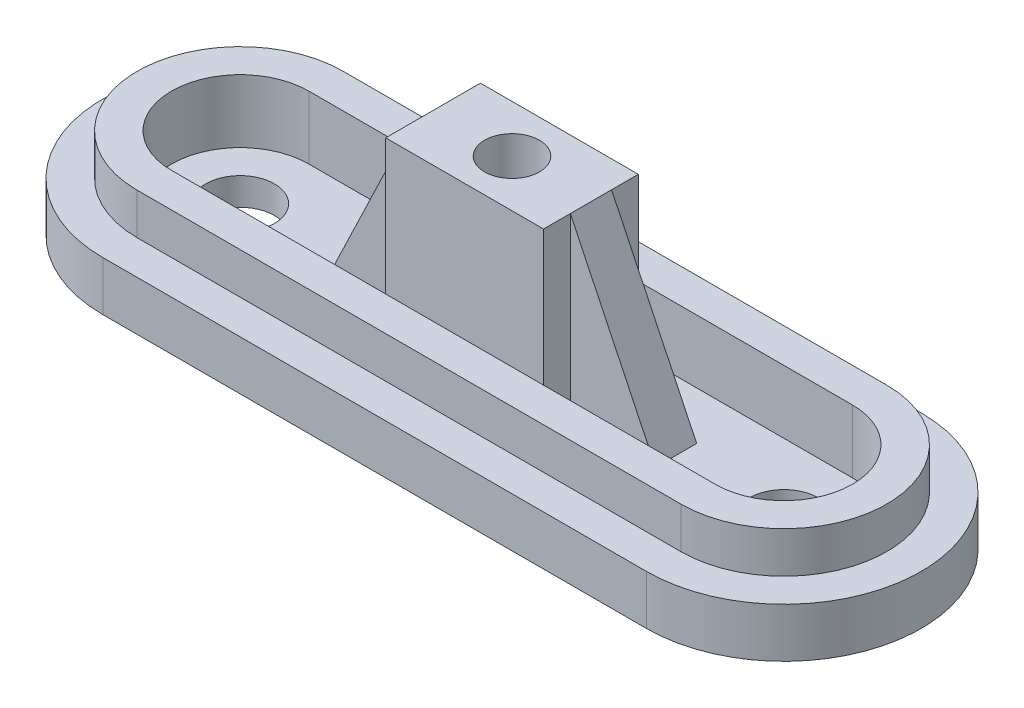
ISO-10303-21;
HEADER;
FILE_DESCRIPTION(('STEP AP214'),'2;1');
FILE_NAME('part.step','',(''),(''),'','','');
FILE_SCHEMA(('AUTOMOTIVE_DESIGN { 1 0 10303 214 1 1 1 1 }'));
ENDSEC;
DATA;
#1=APPLICATION_CONTEXT('core data for automotive mechanical design processes');
#2=APPLICATION_PROTOCOL_DEFINITION('international standard','automotive_design',2000,#1);
#3=PRODUCT_CONTEXT('',#1,'mechanical');
#4=PRODUCT('Part','Part','',(#3));
#5=PRODUCT_RELATED_PRODUCT_CATEGORY('part','',(#4));
#6=PRODUCT_DEFINITION_FORMATION('','',#4);
#7=PRODUCT_DEFINITION_CONTEXT('part definition',#1,'design');
#8=PRODUCT_DEFINITION('design','',#6,#7);
#9=PRODUCT_DEFINITION_SHAPE('','',#8);
#10=(LENGTH_UNIT() NAMED_UNIT(*) SI_UNIT(.MILLI.,.METRE.));
#11=(NAMED_UNIT(*) PLANE_ANGLE_UNIT() SI_UNIT($,.RADIAN.));
#12=(NAMED_UNIT(*) SI_UNIT($,.STERADIAN.) SOLID_ANGLE_UNIT());
#13=UNCERTAINTY_MEASURE_WITH_UNIT(LENGTH_MEASURE(1.E-05),#10,'distance_accuracy_value','');
#14=(GEOMETRIC_REPRESENTATION_CONTEXT(3) GLOBAL_UNCERTAINTY_ASSIGNED_CONTEXT((#13)) GLOBAL_UNIT_ASSIGNED_CONTEXT((#10,
#11,#12)) REPRESENTATION_CONTEXT('',''));
#15=CARTESIAN_POINT('',(0.,0.,0.));
#16=DIRECTION('',(0.,0.,1.));
#17=DIRECTION('',(1.,0.,0.));
#18=AXIS2_PLACEMENT_3D('',#15,#16,#17);
#19=CARTESIAN_POINT('',(57.5,149.,0.));
#20=DIRECTION('',(-1.,0.,0.));
#21=DIRECTION('',(0.,0.,1.));
#22=AXIS2_PLACEMENT_3D('',#19,#20,#21);
#23=PLANE('',#22);
#24=DIRECTION('',(0.,-1.,0.));
#25=VECTOR('',#24,1.);
#26=CARTESIAN_POINT('',(57.5,149.,15.));
#27=LINE('',#26,#25);
#28=CARTESIAN_POINT('',(57.5,149.,15.));
#29=VERTEX_POINT('',#28);
#30=CARTESIAN_POINT('',(57.5,20.,15.));
#31=VERTEX_POINT('',#30);
#32=EDGE_CURVE('E197',#29,#31,#27,.T.);
#33=ORIENTED_EDGE('',*,*,#32,.F.);
#34=DIRECTION('',(0.,0.,-1.));
#35=VECTOR('',#34,1.);
#36=CARTESIAN_POINT('',(57.5,149.,0.));
#37=LINE('',#36,#35);
#38=CARTESIAN_POINT('',(57.5,149.,34.5));
#39=VERTEX_POINT('',#38);
#40=EDGE_CURVE('E254',#39,#29,#37,.T.);
#41=ORIENTED_EDGE('',*,*,#40,.F.);
#42=DIRECTION('',(0.,-1.,0.));
#43=VECTOR('',#42,1.);
#44=CARTESIAN_POINT('',(57.5,149.,34.5));
#45=LINE('',#44,#43);
#46=CARTESIAN_POINT('',(57.5,20.,34.5));
#47=VERTEX_POINT('',#46);
#48=EDGE_CURVE('E283',#39,#47,#45,.T.);
#49=ORIENTED_EDGE('',*,*,#48,.T.);
#50=DIRECTION('',(0.,0.,-1.));
#51=VECTOR('',#50,1.);
#52=CARTESIAN_POINT('',(57.5,20.,0.));
#53=LINE('',#52,#51);
#54=EDGE_CURVE('E317',#47,#31,#53,.T.);
#55=ORIENTED_EDGE('',*,*,#54,.T.);
#56=EDGE_LOOP('',(#33,#41,#49,#55));
#57=FACE_BOUND('',#56,.T.);
#58=ADVANCED_FACE('F43',(#57),#23,.F.);
#59=CARTESIAN_POINT('',(-57.5,149.,0.));
#60=DIRECTION('',(-1.,0.,0.));
#61=DIRECTION('',(0.,0.,1.));
#62=AXIS2_PLACEMENT_3D('',#59,#60,#61);
#63=PLANE('',#62);
#64=DIRECTION('',(0.,0.,-1.));
#65=VECTOR('',#64,1.);
#66=CARTESIAN_POINT('',(-57.5,149.,0.));
#67=LINE('',#66,#65);
#68=CARTESIAN_POINT('',(-57.5,149.,34.5));
#69=VERTEX_POINT('',#68);
#70=CARTESIAN_POINT('',(-57.5,149.,15.));
#71=VERTEX_POINT('',#70);
#72=EDGE_CURVE('E263',#69,#71,#67,.T.);
#73=ORIENTED_EDGE('',*,*,#72,.T.);
#74=DIRECTION('',(0.,-1.,0.));
#75=VECTOR('',#74,1.);
#76=CARTESIAN_POINT('',(-57.5,149.,15.));
#77=LINE('',#76,#75);
#78=CARTESIAN_POINT('',(-57.5,20.,15.));
#79=VERTEX_POINT('',#78);
#80=EDGE_CURVE('E228',#71,#79,#77,.T.);
#81=ORIENTED_EDGE('',*,*,#80,.T.);
#82=DIRECTION('',(0.,0.,-1.));
#83=VECTOR('',#82,1.);
#84=CARTESIAN_POINT('',(-57.5,20.,0.));
#85=LINE('',#84,#83);
#86=CARTESIAN_POINT('',(-57.5,20.,34.5));
#87=VERTEX_POINT('',#86);
#88=EDGE_CURVE('E322',#87,#79,#85,.T.);
#89=ORIENTED_EDGE('',*,*,#88,.F.);
#90=DIRECTION('',(0.,-1.,0.));
#91=VECTOR('',#90,1.);
#92=CARTESIAN_POINT('',(-57.5,149.,34.5));
#93=LINE('',#92,#91);
#94=EDGE_CURVE('E267',#69,#87,#93,.T.);
#95=ORIENTED_EDGE('',*,*,#94,.F.);
#96=EDGE_LOOP('',(#73,#81,#89,#95));
#97=FACE_BOUND('',#96,.T.);
#98=ADVANCED_FACE('F523',(#97),#63,.T.);
#99=CARTESIAN_POINT('',(198.,36.,0.));
#100=DIRECTION('',(0.,-1.,0.));
#101=DIRECTION('',(0.,0.,-1.));
#102=AXIS2_PLACEMENT_3D('',#99,#100,#101);
#103=CYLINDRICAL_SURFACE('',#102,100.);
#104=CARTESIAN_POINT('',(198.,36.,0.));
#105=DIRECTION('',(0.,1.,0.));
#106=DIRECTION('',(0.,0.,1.));
#107=AXIS2_PLACEMENT_3D('',#104,#105,#106);
#108=CIRCLE('',#107,100.);
#109=CARTESIAN_POINT('',(198.,36.,-100.));
#110=VERTEX_POINT('',#109);
#111=CARTESIAN_POINT('',(198.,36.,100.));
#112=VERTEX_POINT('',#111);
#113=EDGE_CURVE('E407',#110,#112,#108,.F.);
#114=ORIENTED_EDGE('',*,*,#113,.T.);
#115=DIRECTION('',(0.,-1.,0.));
#116=VECTOR('',#115,1.);
#117=CARTESIAN_POINT('',(198.,36.,100.));
#118=LINE('',#117,#116);
#119=CARTESIAN_POINT('',(198.,0.,100.));
#120=VERTEX_POINT('',#119);
#121=EDGE_CURVE('E421',#112,#120,#118,.T.);
#122=ORIENTED_EDGE('',*,*,#121,.T.);
#123=CARTESIAN_POINT('',(198.,0.,0.));
#124=DIRECTION('',(0.,1.,0.));
#125=DIRECTION('',(0.,0.,1.));
#126=AXIS2_PLACEMENT_3D('',#123,#124,#125);
#127=CIRCLE('',#126,100.);
#128=CARTESIAN_POINT('',(198.,0.,-100.));
#129=VERTEX_POINT('',#128);
#130=EDGE_CURVE('E378',#129,#120,#127,.F.);
#131=ORIENTED_EDGE('',*,*,#130,.F.);
#132=DIRECTION('',(0.,-1.,0.));
#133=VECTOR('',#132,1.);
#134=CARTESIAN_POINT('',(198.,36.,-100.));
#135=LINE('',#134,#133);
#136=EDGE_CURVE('E12',#110,#129,#135,.T.);
#137=ORIENTED_EDGE('',*,*,#136,.F.);
#138=EDGE_LOOP('',(#114,#122,#131,#137));
#139=FACE_BOUND('',#138,.T.);
#140=ADVANCED_FACE('F45',(#139),#103,.T.);
#141=CARTESIAN_POINT('',(0.,36.,-100.));
#142=DIRECTION('',(0.,0.,-1.));
#143=DIRECTION('',(-1.,0.,0.));
#144=AXIS2_PLACEMENT_3D('',#141,#142,#143);
#145=PLANE('',#144);
#146=DIRECTION('',(1.,0.,0.));
#147=VECTOR('',#146,1.);
#148=CARTESIAN_POINT('',(0.,0.,-100.));
#149=LINE('',#148,#147);
#150=CARTESIAN_POINT('',(-198.,0.,-100.));
#151=VERTEX_POINT('',#150);
#152=EDGE_CURVE('E424',#151,#129,#149,.T.);
#153=ORIENTED_EDGE('',*,*,#152,.F.);
#154=DIRECTION('',(0.,-1.,0.));
#155=VECTOR('',#154,1.);
#156=CARTESIAN_POINT('',(-198.,36.,-100.));
#157=LINE('',#156,#155);
#158=CARTESIAN_POINT('',(-198.,36.,-100.));
#159=VERTEX_POINT('',#158);
#160=EDGE_CURVE('E52',#159,#151,#157,.T.);
#161=ORIENTED_EDGE('',*,*,#160,.F.);
#162=DIRECTION('',(1.,0.,0.));
#163=VECTOR('',#162,1.);
#164=CARTESIAN_POINT('',(0.,36.,-100.));
#165=LINE('',#164,#163);
#166=EDGE_CURVE('E410',#159,#110,#165,.T.);
#167=ORIENTED_EDGE('',*,*,#166,.T.);
#168=ORIENTED_EDGE('',*,*,#136,.T.);
#169=EDGE_LOOP('',(#153,#161,#167,#168));
#170=FACE_BOUND('',#169,.T.);
#171=ADVANCED_FACE('F453',(#170),#145,.T.);
#172=CARTESIAN_POINT('',(-198.,36.,0.));
#173=DIRECTION('',(0.,-1.,0.));
#174=DIRECTION('',(0.,0.,-1.));
#175=AXIS2_PLACEMENT_3D('',#172,#173,#174);
#176=CYLINDRICAL_SURFACE('',#175,100.);
#177=CARTESIAN_POINT('',(-198.,0.,0.));
#178=DIRECTION('',(0.,1.,0.));
#179=DIRECTION('',(0.,0.,1.));
#180=AXIS2_PLACEMENT_3D('',#177,#178,#179);
#181=CIRCLE('',#180,100.);
#182=CARTESIAN_POINT('',(-198.,0.,100.));
#183=VERTEX_POINT('',#182);
#184=EDGE_CURVE('E428',#151,#183,#181,.T.);
#185=ORIENTED_EDGE('',*,*,#184,.T.);
#186=DIRECTION('',(0.,-1.,0.));
#187=VECTOR('',#186,1.);
#188=CARTESIAN_POINT('',(-198.,36.,100.));
#189=LINE('',#188,#187);
#190=CARTESIAN_POINT('',(-198.,36.,100.));
#191=VERTEX_POINT('',#190);
#192=EDGE_CURVE('E437',#191,#183,#189,.T.);
#193=ORIENTED_EDGE('',*,*,#192,.F.);
#194=CARTESIAN_POINT('',(-198.,36.,0.));
#195=DIRECTION('',(0.,1.,0.));
#196=DIRECTION('',(0.,0.,1.));
#197=AXIS2_PLACEMENT_3D('',#194,#195,#196);
#198=CIRCLE('',#197,100.);
#199=EDGE_CURVE('E414',#159,#191,#198,.T.);
#200=ORIENTED_EDGE('',*,*,#199,.F.);
#201=ORIENTED_EDGE('',*,*,#160,.T.);
#202=EDGE_LOOP('',(#185,#193,#200,#201));
#203=FACE_BOUND('',#202,.T.);
#204=ADVANCED_FACE('F444',(#203),#176,.T.);
#205=CARTESIAN_POINT('',(0.,36.,100.));
#206=DIRECTION('',(0.,0.,-1.));
#207=DIRECTION('',(-1.,0.,0.));
#208=AXIS2_PLACEMENT_3D('',#205,#206,#207);
#209=PLANE('',#208);
#210=DIRECTION('',(1.,0.,0.));
#211=VECTOR('',#210,1.);
#212=CARTESIAN_POINT('',(0.,0.,100.));
#213=LINE('',#212,#211);
#214=EDGE_CURVE('E397',#183,#120,#213,.T.);
#215=ORIENTED_EDGE('',*,*,#214,.T.);
#216=ORIENTED_EDGE('',*,*,#121,.F.);
#217=DIRECTION('',(1.,0.,0.));
#218=VECTOR('',#217,1.);
#219=CARTESIAN_POINT('',(0.,36.,100.));
#220=LINE('',#219,#218);
#221=EDGE_CURVE('E417',#191,#112,#220,.T.);
#222=ORIENTED_EDGE('',*,*,#221,.F.);
#223=ORIENTED_EDGE('',*,*,#192,.T.);
#224=EDGE_LOOP('',(#215,#216,#222,#223));
#225=FACE_BOUND('',#224,.T.);
#226=ADVANCED_FACE('F460',(#225),#209,.F.);
#227=CARTESIAN_POINT('',(0.,36.,0.));
#228=DIRECTION('',(0.,1.,0.));
#229=DIRECTION('',(0.,0.,1.));
#230=AXIS2_PLACEMENT_3D('',#227,#228,#229);
#231=PLANE('',#230);
#232=ORIENTED_EDGE('',*,*,#199,.T.);
#233=ORIENTED_EDGE('',*,*,#221,.T.);
#234=ORIENTED_EDGE('',*,*,#113,.F.);
#235=ORIENTED_EDGE('',*,*,#166,.F.);
#236=EDGE_LOOP('',(#232,#233,#234,#235));
#237=FACE_BOUND('',#236,.T.);
#238=CARTESIAN_POINT('',(-198.,36.,0.));
#239=DIRECTION('',(0.,1.,0.));
#240=DIRECTION('',(0.,0.,1.));
#241=AXIS2_PLACEMENT_3D('',#238,#239,#240);
#242=CIRCLE('',#241,75.);
#243=CARTESIAN_POINT('',(-198.,36.,75.));
#244=VERTEX_POINT('',#243);
#245=CARTESIAN_POINT('',(-198.,36.,-75.));
#246=VERTEX_POINT('',#245);
#247=EDGE_CURVE('E400',#244,#246,#242,.F.);
#248=ORIENTED_EDGE('',*,*,#247,.T.);
#249=DIRECTION('',(1.,0.,0.));
#250=VECTOR('',#249,1.);
#251=CARTESIAN_POINT('',(0.,36.,-75.));
#252=LINE('',#251,#250);
#253=CARTESIAN_POINT('',(198.,36.,-75.));
#254=VERTEX_POINT('',#253);
#255=EDGE_CURVE('E403',#246,#254,#252,.T.);
#256=ORIENTED_EDGE('',*,*,#255,.T.);
#257=CARTESIAN_POINT('',(198.,36.,0.));
#258=DIRECTION('',(0.,1.,0.));
#259=DIRECTION('',(0.,0.,1.));
#260=AXIS2_PLACEMENT_3D('',#257,#258,#259);
#261=CIRCLE('',#260,75.);
#262=CARTESIAN_POINT('',(198.,36.,75.));
#263=VERTEX_POINT('',#262);
#264=EDGE_CURVE('E393',#263,#254,#261,.T.);
#265=ORIENTED_EDGE('',*,*,#264,.F.);
#266=DIRECTION('',(1.,0.,0.));
#267=VECTOR('',#266,1.);
#268=CARTESIAN_POINT('',(0.,36.,75.));
#269=LINE('',#268,#267);
#270=EDGE_CURVE('E396',#244,#263,#269,.T.);
#271=ORIENTED_EDGE('',*,*,#270,.F.);
#272=EDGE_LOOP('',(#248,#256,#265,#271));
#273=FACE_BOUND('',#272,.T.);
#274=ADVANCED_FACE('F462',(#237,#273),#231,.T.);
#275=CARTESIAN_POINT('',(0.,0.,0.));
#276=DIRECTION('',(0.,1.,0.));
#277=DIRECTION('',(0.,0.,1.));
#278=AXIS2_PLACEMENT_3D('',#275,#276,#277);
#279=PLANE('',#278);
#280=CARTESIAN_POINT('',(0.,0.,0.));
#281=DIRECTION('',(0.,1.,0.));
#282=DIRECTION('',(0.,0.,1.));
#283=AXIS2_PLACEMENT_3D('',#280,#281,#282);
#284=CIRCLE('',#283,20.);
#285=CARTESIAN_POINT('',(0.,0.,20.));
#286=VERTEX_POINT('',#285);
#287=EDGE_CURVE('E244',#286,#286,#284,.T.);
#288=ORIENTED_EDGE('',*,*,#287,.T.);
#289=EDGE_LOOP('',(#288));
#290=FACE_BOUND('',#289,.T.);
#291=CARTESIAN_POINT('',(-198.,0.,0.));
#292=DIRECTION('',(0.,1.,0.));
#293=DIRECTION('',(0.,0.,1.));
#294=AXIS2_PLACEMENT_3D('',#291,#292,#293);
#295=CIRCLE('',#294,25.);
#296=CARTESIAN_POINT('',(-198.,0.,25.));
#297=VERTEX_POINT('',#296);
#298=EDGE_CURVE('E292',#297,#297,#295,.T.);
#299=ORIENTED_EDGE('',*,*,#298,.T.);
#300=EDGE_LOOP('',(#299));
#301=FACE_BOUND('',#300,.T.);
#302=ORIENTED_EDGE('',*,*,#214,.F.);
#303=ORIENTED_EDGE('',*,*,#184,.F.);
#304=ORIENTED_EDGE('',*,*,#152,.T.);
#305=ORIENTED_EDGE('',*,*,#130,.T.);
#306=EDGE_LOOP('',(#302,#303,#304,#305));
#307=FACE_BOUND('',#306,.T.);
#308=CARTESIAN_POINT('',(198.,0.,0.));
#309=DIRECTION('',(0.,1.,0.));
#310=DIRECTION('',(0.,0.,1.));
#311=AXIS2_PLACEMENT_3D('',#308,#309,#310);
#312=CIRCLE('',#311,25.);
#313=CARTESIAN_POINT('',(198.,0.,24.9999999999999));
#314=VERTEX_POINT('',#313);
#315=EDGE_CURVE('E288',#314,#314,#312,.F.);
#316=ORIENTED_EDGE('',*,*,#315,.F.);
#317=EDGE_LOOP('',(#316));
#318=FACE_BOUND('',#317,.T.);
#319=ADVANCED_FACE('F451',(#290,#301,#307,#318),#279,.F.);
#320=CARTESIAN_POINT('',(0.,66.,-50.));
#321=DIRECTION('',(0.,0.,-1.));
#322=DIRECTION('',(-1.,0.,0.));
#323=AXIS2_PLACEMENT_3D('',#320,#321,#322);
#324=PLANE('',#323);
#325=DIRECTION('',(0.,-1.,0.));
#326=VECTOR('',#325,1.);
#327=CARTESIAN_POINT('',(-198.,66.,-50.));
#328=LINE('',#327,#326);
#329=CARTESIAN_POINT('',(-198.,66.,-50.));
#330=VERTEX_POINT('',#329);
#331=CARTESIAN_POINT('',(-198.,20.,-50.));
#332=VERTEX_POINT('',#331);
#333=EDGE_CURVE('E361',#330,#332,#328,.T.);
#334=ORIENTED_EDGE('',*,*,#333,.T.);
#335=DIRECTION('',(1.,0.,0.));
#336=VECTOR('',#335,1.);
#337=CARTESIAN_POINT('',(0.,20.,-50.));
#338=LINE('',#337,#336);
#339=CARTESIAN_POINT('',(198.,20.,-50.));
#340=VERTEX_POINT('',#339);
#341=EDGE_CURVE('E311',#332,#340,#338,.T.);
#342=ORIENTED_EDGE('',*,*,#341,.T.);
#343=DIRECTION('',(0.,-1.,0.));
#344=VECTOR('',#343,1.);
#345=CARTESIAN_POINT('',(198.,66.,-50.));
#346=LINE('',#345,#344);
#347=CARTESIAN_POINT('',(198.,66.,-50.));
#348=VERTEX_POINT('',#347);
#349=EDGE_CURVE('E374',#348,#340,#346,.T.);
#350=ORIENTED_EDGE('',*,*,#349,.F.);
#351=DIRECTION('',(1.,0.,0.));
#352=VECTOR('',#351,1.);
#353=CARTESIAN_POINT('',(0.,66.,-50.));
#354=LINE('',#353,#352);
#355=EDGE_CURVE('E346',#330,#348,#354,.T.);
#356=ORIENTED_EDGE('',*,*,#355,.F.);
#357=EDGE_LOOP('',(#334,#342,#350,#356));
#358=FACE_BOUND('',#357,.T.);
#359=ADVANCED_FACE('F502',(#358),#324,.F.);
#360=CARTESIAN_POINT('',(198.,66.,0.));
#361=DIRECTION('',(0.,-1.,0.));
#362=DIRECTION('',(0.,0.,-1.));
#363=AXIS2_PLACEMENT_3D('',#360,#361,#362);
#364=CYLINDRICAL_SURFACE('',#363,50.);
#365=CARTESIAN_POINT('',(198.,20.,0.));
#366=DIRECTION('',(0.,1.,0.));
#367=DIRECTION('',(0.,0.,1.));
#368=AXIS2_PLACEMENT_3D('',#365,#366,#367);
#369=CIRCLE('',#368,50.);
#370=CARTESIAN_POINT('',(198.,20.,50.));
#371=VERTEX_POINT('',#370);
#372=EDGE_CURVE('E287',#340,#371,#369,.F.);
#373=ORIENTED_EDGE('',*,*,#372,.T.);
#374=DIRECTION('',(0.,-1.,0.));
#375=VECTOR('',#374,1.);
#376=CARTESIAN_POINT('',(198.,66.,50.));
#377=LINE('',#376,#375);
#378=CARTESIAN_POINT('',(198.,66.,50.));
#379=VERTEX_POINT('',#378);
#380=EDGE_CURVE('E370',#379,#371,#377,.T.);
#381=ORIENTED_EDGE('',*,*,#380,.F.);
#382=CARTESIAN_POINT('',(198.,66.,0.));
#383=DIRECTION('',(0.,1.,0.));
#384=DIRECTION('',(0.,0.,1.));
#385=AXIS2_PLACEMENT_3D('',#382,#383,#384);
#386=CIRCLE('',#385,50.);
#387=EDGE_CURVE('E350',#348,#379,#386,.F.);
#388=ORIENTED_EDGE('',*,*,#387,.F.);
#389=ORIENTED_EDGE('',*,*,#349,.T.);
#390=EDGE_LOOP('',(#373,#381,#388,#389));
#391=FACE_BOUND('',#390,.T.);
#392=ADVANCED_FACE('F505',(#391),#364,.F.);
#393=CARTESIAN_POINT('',(0.,66.,50.));
#394=DIRECTION('',(0.,0.,-1.));
#395=DIRECTION('',(-1.,0.,0.));
#396=AXIS2_PLACEMENT_3D('',#393,#394,#395);
#397=PLANE('',#396);
#398=DIRECTION('',(1.,0.,0.));
#399=VECTOR('',#398,1.);
#400=CARTESIAN_POINT('',(0.,20.,50.));
#401=LINE('',#400,#399);
#402=CARTESIAN_POINT('',(-198.,20.,50.));
#403=VERTEX_POINT('',#402);
#404=EDGE_CURVE('E310',#403,#371,#401,.T.);
#405=ORIENTED_EDGE('',*,*,#404,.F.);
#406=DIRECTION('',(0.,-1.,0.));
#407=VECTOR('',#406,1.);
#408=CARTESIAN_POINT('',(-198.,66.,50.));
#409=LINE('',#408,#407);
#410=CARTESIAN_POINT('',(-198.,66.,50.));
#411=VERTEX_POINT('',#410);
#412=EDGE_CURVE('E365',#411,#403,#409,.T.);
#413=ORIENTED_EDGE('',*,*,#412,.F.);
#414=DIRECTION('',(1.,0.,0.));
#415=VECTOR('',#414,1.);
#416=CARTESIAN_POINT('',(0.,66.,50.));
#417=LINE('',#416,#415);
#418=EDGE_CURVE('E353',#411,#379,#417,.T.);
#419=ORIENTED_EDGE('',*,*,#418,.T.);
#420=ORIENTED_EDGE('',*,*,#380,.T.);
#421=EDGE_LOOP('',(#405,#413,#419,#420));
#422=FACE_BOUND('',#421,.T.);
#423=ADVANCED_FACE('F496',(#422),#397,.T.);
#424=CARTESIAN_POINT('',(0.,66.,75.));
#425=DIRECTION('',(0.,0.,-1.));
#426=DIRECTION('',(-1.,0.,0.));
#427=AXIS2_PLACEMENT_3D('',#424,#425,#426);
#428=PLANE('',#427);
#429=ORIENTED_EDGE('',*,*,#270,.T.);
#430=DIRECTION('',(0.,-1.,0.));
#431=VECTOR('',#430,1.);
#432=CARTESIAN_POINT('',(198.,66.,75.));
#433=LINE('',#432,#431);
#434=CARTESIAN_POINT('',(198.,66.,75.));
#435=VERTEX_POINT('',#434);
#436=EDGE_CURVE('E366',#435,#263,#433,.T.);
#437=ORIENTED_EDGE('',*,*,#436,.F.);
#438=DIRECTION('',(1.,0.,0.));
#439=VECTOR('',#438,1.);
#440=CARTESIAN_POINT('',(0.,66.,75.));
#441=LINE('',#440,#439);
#442=CARTESIAN_POINT('',(-198.,66.,75.));
#443=VERTEX_POINT('',#442);
#444=EDGE_CURVE('E302',#443,#435,#441,.T.);
#445=ORIENTED_EDGE('',*,*,#444,.F.);
#446=DIRECTION('',(0.,-1.,0.));
#447=VECTOR('',#446,1.);
#448=CARTESIAN_POINT('',(-198.,66.,75.));
#449=LINE('',#448,#447);
#450=EDGE_CURVE('E360',#443,#244,#449,.T.);
#451=ORIENTED_EDGE('',*,*,#450,.T.);
#452=EDGE_LOOP('',(#429,#437,#445,#451));
#453=FACE_BOUND('',#452,.T.);
#454=ADVANCED_FACE('F482',(#453),#428,.F.);
#455=CARTESIAN_POINT('',(198.,66.,0.));
#456=DIRECTION('',(0.,-1.,0.));
#457=DIRECTION('',(0.,0.,-1.));
#458=AXIS2_PLACEMENT_3D('',#455,#456,#457);
#459=CYLINDRICAL_SURFACE('',#458,75.);
#460=DIRECTION('',(0.,-1.,0.));
#461=VECTOR('',#460,1.);
#462=CARTESIAN_POINT('',(198.,66.,-75.));
#463=LINE('',#462,#461);
#464=CARTESIAN_POINT('',(198.,66.,-75.));
#465=VERTEX_POINT('',#464);
#466=EDGE_CURVE('E386',#465,#254,#463,.T.);
#467=ORIENTED_EDGE('',*,*,#466,.F.);
#468=CARTESIAN_POINT('',(198.,66.,0.));
#469=DIRECTION('',(0.,1.,0.));
#470=DIRECTION('',(0.,0.,1.));
#471=AXIS2_PLACEMENT_3D('',#468,#469,#470);
#472=CIRCLE('',#471,75.);
#473=EDGE_CURVE('E336',#435,#465,#472,.T.);
#474=ORIENTED_EDGE('',*,*,#473,.F.);
#475=ORIENTED_EDGE('',*,*,#436,.T.);
#476=ORIENTED_EDGE('',*,*,#264,.T.);
#477=EDGE_LOOP('',(#467,#474,#475,#476));
#478=FACE_BOUND('',#477,.T.);
#479=ADVANCED_FACE('F478',(#478),#459,.T.);
#480=CARTESIAN_POINT('',(0.,66.,-75.));
#481=DIRECTION('',(0.,0.,-1.));
#482=DIRECTION('',(-1.,0.,0.));
#483=AXIS2_PLACEMENT_3D('',#480,#481,#482);
#484=PLANE('',#483);
#485=ORIENTED_EDGE('',*,*,#466,.T.);
#486=ORIENTED_EDGE('',*,*,#255,.F.);
#487=DIRECTION('',(0.,-1.,0.));
#488=VECTOR('',#487,1.);
#489=CARTESIAN_POINT('',(-198.,66.,-75.));
#490=LINE('',#489,#488);
#491=CARTESIAN_POINT('',(-198.,66.,-75.));
#492=VERTEX_POINT('',#491);
#493=EDGE_CURVE('E382',#492,#246,#490,.T.);
#494=ORIENTED_EDGE('',*,*,#493,.F.);
#495=DIRECTION('',(1.,0.,0.));
#496=VECTOR('',#495,1.);
#497=CARTESIAN_POINT('',(0.,66.,-75.));
#498=LINE('',#497,#496);
#499=EDGE_CURVE('E339',#492,#465,#498,.T.);
#500=ORIENTED_EDGE('',*,*,#499,.T.);
#501=EDGE_LOOP('',(#485,#486,#494,#500));
#502=FACE_BOUND('',#501,.T.);
#503=ADVANCED_FACE('F475',(#502),#484,.T.);
#504=CARTESIAN_POINT('',(-198.,66.,0.));
#505=DIRECTION('',(0.,-1.,0.));
#506=DIRECTION('',(0.,0.,-1.));
#507=AXIS2_PLACEMENT_3D('',#504,#505,#506);
#508=CYLINDRICAL_SURFACE('',#507,75.);
#509=ORIENTED_EDGE('',*,*,#493,.T.);
#510=ORIENTED_EDGE('',*,*,#247,.F.);
#511=ORIENTED_EDGE('',*,*,#450,.F.);
#512=CARTESIAN_POINT('',(-198.,66.,0.));
#513=DIRECTION('',(0.,1.,0.));
#514=DIRECTION('',(0.,0.,1.));
#515=AXIS2_PLACEMENT_3D('',#512,#513,#514);
#516=CIRCLE('',#515,75.);
#517=EDGE_CURVE('E343',#443,#492,#516,.F.);
#518=ORIENTED_EDGE('',*,*,#517,.T.);
#519=EDGE_LOOP('',(#509,#510,#511,#518));
#520=FACE_BOUND('',#519,.T.);
#521=ADVANCED_FACE('F471',(#520),#508,.T.);
#522=CARTESIAN_POINT('',(-198.,66.,0.));
#523=DIRECTION('',(0.,-1.,0.));
#524=DIRECTION('',(0.,0.,-1.));
#525=AXIS2_PLACEMENT_3D('',#522,#523,#524);
#526=CYLINDRICAL_SURFACE('',#525,50.);
#527=CARTESIAN_POINT('',(-198.,66.,0.));
#528=DIRECTION('',(0.,1.,0.));
#529=DIRECTION('',(0.,0.,1.));
#530=AXIS2_PLACEMENT_3D('',#527,#528,#529);
#531=CIRCLE('',#530,50.);
#532=EDGE_CURVE('E357',#330,#411,#531,.T.);
#533=ORIENTED_EDGE('',*,*,#532,.T.);
#534=ORIENTED_EDGE('',*,*,#412,.T.);
#535=CARTESIAN_POINT('',(-198.,20.,0.));
#536=DIRECTION('',(0.,1.,0.));
#537=DIRECTION('',(0.,0.,1.));
#538=AXIS2_PLACEMENT_3D('',#535,#536,#537);
#539=CIRCLE('',#538,50.);
#540=EDGE_CURVE('E297',#332,#403,#539,.T.);
#541=ORIENTED_EDGE('',*,*,#540,.F.);
#542=ORIENTED_EDGE('',*,*,#333,.F.);
#543=EDGE_LOOP('',(#533,#534,#541,#542));
#544=FACE_BOUND('',#543,.T.);
#545=ADVANCED_FACE('F488',(#544),#526,.F.);
#546=CARTESIAN_POINT('',(0.,66.,0.));
#547=DIRECTION('',(0.,1.,0.));
#548=DIRECTION('',(0.,0.,1.));
#549=AXIS2_PLACEMENT_3D('',#546,#547,#548);
#550=PLANE('',#549);
#551=ORIENTED_EDGE('',*,*,#499,.F.);
#552=ORIENTED_EDGE('',*,*,#517,.F.);
#553=ORIENTED_EDGE('',*,*,#444,.T.);
#554=ORIENTED_EDGE('',*,*,#473,.T.);
#555=EDGE_LOOP('',(#551,#552,#553,#554));
#556=FACE_BOUND('',#555,.T.);
#557=ORIENTED_EDGE('',*,*,#418,.F.);
#558=ORIENTED_EDGE('',*,*,#532,.F.);
#559=ORIENTED_EDGE('',*,*,#355,.T.);
#560=ORIENTED_EDGE('',*,*,#387,.T.);
#561=EDGE_LOOP('',(#557,#558,#559,#560));
#562=FACE_BOUND('',#561,.T.);
#563=ADVANCED_FACE('F484',(#556,#562),#550,.T.);
#564=CARTESIAN_POINT('',(-198.,571.980236768196,0.));
#565=DIRECTION('',(0.,-1.,0.));
#566=DIRECTION('',(0.,0.,-1.));
#567=AXIS2_PLACEMENT_3D('',#564,#565,#566);
#568=CYLINDRICAL_SURFACE('',#567,25.);
#569=ORIENTED_EDGE('',*,*,#298,.F.);
#570=EDGE_LOOP('',(#569));
#571=FACE_BOUND('',#570,.T.);
#572=CARTESIAN_POINT('',(-198.,20.,0.));
#573=DIRECTION('',(0.,1.,0.));
#574=DIRECTION('',(0.,0.,1.));
#575=AXIS2_PLACEMENT_3D('',#572,#573,#574);
#576=CIRCLE('',#575,25.);
#577=CARTESIAN_POINT('',(-198.,20.,25.));
#578=VERTEX_POINT('',#577);
#579=EDGE_CURVE('E293',#578,#578,#576,.T.);
#580=ORIENTED_EDGE('',*,*,#579,.T.);
#581=EDGE_LOOP('',(#580));
#582=FACE_BOUND('',#581,.T.);
#583=ADVANCED_FACE('F487',(#571,#582),#568,.F.);
#584=CARTESIAN_POINT('',(198.,571.980236768196,0.));
#585=DIRECTION('',(0.,-1.,0.));
#586=DIRECTION('',(0.,0.,-1.));
#587=AXIS2_PLACEMENT_3D('',#584,#585,#586);
#588=CYLINDRICAL_SURFACE('',#587,25.);
#589=CARTESIAN_POINT('',(198.,20.,0.));
#590=DIRECTION('',(0.,1.,0.));
#591=DIRECTION('',(0.,0.,1.));
#592=AXIS2_PLACEMENT_3D('',#589,#590,#591);
#593=CIRCLE('',#592,25.);
#594=CARTESIAN_POINT('',(198.,20.,24.9999999999999));
#595=VERTEX_POINT('',#594);
#596=EDGE_CURVE('E298',#595,#595,#593,.F.);
#597=ORIENTED_EDGE('',*,*,#596,.F.);
#598=EDGE_LOOP('',(#597));
#599=FACE_BOUND('',#598,.T.);
#600=ORIENTED_EDGE('',*,*,#315,.T.);
#601=EDGE_LOOP('',(#600));
#602=FACE_BOUND('',#601,.T.);
#603=ADVANCED_FACE('F509',(#599,#602),#588,.F.);
#604=CARTESIAN_POINT('',(0.,20.,0.));
#605=DIRECTION('',(0.,1.,0.));
#606=DIRECTION('',(0.,0.,1.));
#607=AXIS2_PLACEMENT_3D('',#604,#605,#606);
#608=PLANE('',#607);
#609=ORIENTED_EDGE('',*,*,#579,.F.);
#610=EDGE_LOOP('',(#609));
#611=FACE_BOUND('',#610,.T.);
#612=ORIENTED_EDGE('',*,*,#540,.T.);
#613=ORIENTED_EDGE('',*,*,#404,.T.);
#614=ORIENTED_EDGE('',*,*,#372,.F.);
#615=ORIENTED_EDGE('',*,*,#341,.F.);
#616=EDGE_LOOP('',(#612,#613,#614,#615));
#617=FACE_BOUND('',#616,.T.);
#618=DIRECTION('',(0.,0.,1.));
#619=VECTOR('',#618,1.);
#620=CARTESIAN_POINT('',(-119.5,20.,0.));
#621=LINE('',#620,#619);
#622=CARTESIAN_POINT('',(-119.5,20.,-15.));
#623=VERTEX_POINT('',#622);
#624=CARTESIAN_POINT('',(-119.5,20.,15.));
#625=VERTEX_POINT('',#624);
#626=EDGE_CURVE('E67',#623,#625,#621,.T.);
#627=ORIENTED_EDGE('',*,*,#626,.F.);
#628=DIRECTION('',(-1.,0.,0.));
#629=VECTOR('',#628,1.);
#630=CARTESIAN_POINT('',(0.,20.,-15.));
#631=LINE('',#630,#629);
#632=CARTESIAN_POINT('',(-57.5,20.,-15.));
#633=VERTEX_POINT('',#632);
#634=EDGE_CURVE('E239',#633,#623,#631,.T.);
#635=ORIENTED_EDGE('',*,*,#634,.F.);
#636=CARTESIAN_POINT('',(-57.5,20.,-34.5));
#637=VERTEX_POINT('',#636);
#638=EDGE_CURVE('E326',#633,#637,#85,.T.);
#639=ORIENTED_EDGE('',*,*,#638,.T.);
#640=DIRECTION('',(1.,0.,0.));
#641=VECTOR('',#640,1.);
#642=CARTESIAN_POINT('',(0.,20.,-34.5));
#643=LINE('',#642,#641);
#644=CARTESIAN_POINT('',(57.5,20.,-34.5));
#645=VERTEX_POINT('',#644);
#646=EDGE_CURVE('E303',#637,#645,#643,.T.);
#647=ORIENTED_EDGE('',*,*,#646,.T.);
#648=CARTESIAN_POINT('',(57.5,20.,-15.));
#649=VERTEX_POINT('',#648);
#650=EDGE_CURVE('E314',#649,#645,#53,.T.);
#651=ORIENTED_EDGE('',*,*,#650,.F.);
#652=DIRECTION('',(-1.,0.,0.));
#653=VECTOR('',#652,1.);
#654=CARTESIAN_POINT('',(0.,20.,-15.));
#655=LINE('',#654,#653);
#656=CARTESIAN_POINT('',(119.5,20.,-15.));
#657=VERTEX_POINT('',#656);
#658=EDGE_CURVE('E214',#657,#649,#655,.T.);
#659=ORIENTED_EDGE('',*,*,#658,.F.);
#660=DIRECTION('',(0.,0.,1.));
#661=VECTOR('',#660,1.);
#662=CARTESIAN_POINT('',(119.5,20.,0.));
#663=LINE('',#662,#661);
#664=CARTESIAN_POINT('',(119.5,20.,15.));
#665=VERTEX_POINT('',#664);
#666=EDGE_CURVE('E205',#665,#657,#663,.F.);
#667=ORIENTED_EDGE('',*,*,#666,.F.);
#668=DIRECTION('',(-1.,0.,0.));
#669=VECTOR('',#668,1.);
#670=CARTESIAN_POINT('',(0.,20.,15.));
#671=LINE('',#670,#669);
#672=EDGE_CURVE('E192',#665,#31,#671,.T.);
#673=ORIENTED_EDGE('',*,*,#672,.T.);
#674=ORIENTED_EDGE('',*,*,#54,.F.);
#675=DIRECTION('',(1.,0.,0.));
#676=VECTOR('',#675,1.);
#677=CARTESIAN_POINT('',(0.,20.,34.5));
#678=LINE('',#677,#676);
#679=EDGE_CURVE('E307',#87,#47,#678,.T.);
#680=ORIENTED_EDGE('',*,*,#679,.F.);
#681=ORIENTED_EDGE('',*,*,#88,.T.);
#682=DIRECTION('',(-1.,0.,0.));
#683=VECTOR('',#682,1.);
#684=CARTESIAN_POINT('',(0.,20.,15.));
#685=LINE('',#684,#683);
#686=EDGE_CURVE('E232',#79,#625,#685,.T.);
#687=ORIENTED_EDGE('',*,*,#686,.T.);
#688=EDGE_LOOP('',(#627,#635,#639,#647,#651,#659,#667,#673,#674,#680,#681,#687));
#689=FACE_BOUND('',#688,.T.);
#690=ORIENTED_EDGE('',*,*,#596,.T.);
#691=EDGE_LOOP('',(#690));
#692=FACE_BOUND('',#691,.T.);
#693=ADVANCED_FACE('F211',(#611,#617,#689,#692),#608,.T.);
#694=CARTESIAN_POINT('',(57.5,149.,-15.));
#695=VERTEX_POINT('',#694);
#696=CARTESIAN_POINT('',(57.5,149.,-34.5));
#697=VERTEX_POINT('',#696);
#698=EDGE_CURVE('E253',#695,#697,#37,.T.);
#699=ORIENTED_EDGE('',*,*,#698,.F.);
#700=DIRECTION('',(0.,-1.,0.));
#701=VECTOR('',#700,1.);
#702=CARTESIAN_POINT('',(57.5,149.,-15.));
#703=LINE('',#702,#701);
#704=EDGE_CURVE('E202',#695,#649,#703,.T.);
#705=ORIENTED_EDGE('',*,*,#704,.T.);
#706=ORIENTED_EDGE('',*,*,#650,.T.);
#707=DIRECTION('',(0.,-1.,0.));
#708=VECTOR('',#707,1.);
#709=CARTESIAN_POINT('',(57.5,149.,-34.5));
#710=LINE('',#709,#708);
#711=EDGE_CURVE('E279',#697,#645,#710,.T.);
#712=ORIENTED_EDGE('',*,*,#711,.F.);
#713=EDGE_LOOP('',(#699,#705,#706,#712));
#714=FACE_BOUND('',#713,.T.);
#715=ADVANCED_FACE('F508',(#714),#23,.F.);
#716=DIRECTION('',(0.,-1.,0.));
#717=VECTOR('',#716,1.);
#718=CARTESIAN_POINT('',(-57.5,149.,-15.));
#719=LINE('',#718,#717);
#720=CARTESIAN_POINT('',(-57.5,149.,-15.));
#721=VERTEX_POINT('',#720);
#722=EDGE_CURVE('E235',#721,#633,#719,.T.);
#723=ORIENTED_EDGE('',*,*,#722,.F.);
#724=CARTESIAN_POINT('',(-57.5,149.,-34.5));
#725=VERTEX_POINT('',#724);
#726=EDGE_CURVE('E262',#721,#725,#67,.T.);
#727=ORIENTED_EDGE('',*,*,#726,.T.);
#728=DIRECTION('',(0.,-1.,0.));
#729=VECTOR('',#728,1.);
#730=CARTESIAN_POINT('',(-57.5,149.,-34.5));
#731=LINE('',#730,#729);
#732=EDGE_CURVE('E275',#725,#637,#731,.T.);
#733=ORIENTED_EDGE('',*,*,#732,.T.);
#734=ORIENTED_EDGE('',*,*,#638,.F.);
#735=EDGE_LOOP('',(#723,#727,#733,#734));
#736=FACE_BOUND('',#735,.T.);
#737=ADVANCED_FACE('F516',(#736),#63,.T.);
#738=CARTESIAN_POINT('',(0.,149.,34.5));
#739=DIRECTION('',(0.,0.,-1.));
#740=DIRECTION('',(-1.,0.,0.));
#741=AXIS2_PLACEMENT_3D('',#738,#739,#740);
#742=PLANE('',#741);
#743=ORIENTED_EDGE('',*,*,#679,.T.);
#744=ORIENTED_EDGE('',*,*,#48,.F.);
#745=DIRECTION('',(1.,0.,0.));
#746=VECTOR('',#745,1.);
#747=CARTESIAN_POINT('',(0.,149.,34.5));
#748=LINE('',#747,#746);
#749=EDGE_CURVE('E249',#69,#39,#748,.T.);
#750=ORIENTED_EDGE('',*,*,#749,.F.);
#751=ORIENTED_EDGE('',*,*,#94,.T.);
#752=EDGE_LOOP('',(#743,#744,#750,#751));
#753=FACE_BOUND('',#752,.T.);
#754=ADVANCED_FACE('F533',(#753),#742,.F.);
#755=CARTESIAN_POINT('',(0.,149.,-34.5));
#756=DIRECTION('',(0.,0.,-1.));
#757=DIRECTION('',(-1.,0.,0.));
#758=AXIS2_PLACEMENT_3D('',#755,#756,#757);
#759=PLANE('',#758);
#760=ORIENTED_EDGE('',*,*,#711,.T.);
#761=ORIENTED_EDGE('',*,*,#646,.F.);
#762=ORIENTED_EDGE('',*,*,#732,.F.);
#763=DIRECTION('',(1.,0.,0.));
#764=VECTOR('',#763,1.);
#765=CARTESIAN_POINT('',(0.,149.,-34.5));
#766=LINE('',#765,#764);
#767=EDGE_CURVE('E258',#725,#697,#766,.T.);
#768=ORIENTED_EDGE('',*,*,#767,.T.);
#769=EDGE_LOOP('',(#760,#761,#762,#768));
#770=FACE_BOUND('',#769,.T.);
#771=ADVANCED_FACE('F532',(#770),#759,.T.);
#772=CARTESIAN_POINT('',(0.,149.,0.));
#773=DIRECTION('',(0.,-1.,0.));
#774=DIRECTION('',(0.,0.,-1.));
#775=AXIS2_PLACEMENT_3D('',#772,#773,#774);
#776=CYLINDRICAL_SURFACE('',#775,20.);
#777=ORIENTED_EDGE('',*,*,#287,.F.);
#778=EDGE_LOOP('',(#777));
#779=FACE_BOUND('',#778,.T.);
#780=CARTESIAN_POINT('',(0.,149.,0.));
#781=DIRECTION('',(0.,1.,0.));
#782=DIRECTION('',(0.,0.,1.));
#783=AXIS2_PLACEMENT_3D('',#780,#781,#782);
#784=CIRCLE('',#783,20.);
#785=CARTESIAN_POINT('',(0.,149.,20.));
#786=VERTEX_POINT('',#785);
#787=EDGE_CURVE('E245',#786,#786,#784,.T.);
#788=ORIENTED_EDGE('',*,*,#787,.T.);
#789=EDGE_LOOP('',(#788));
#790=FACE_BOUND('',#789,.T.);
#791=ADVANCED_FACE('F537',(#779,#790),#776,.F.);
#792=CARTESIAN_POINT('',(0.,149.,0.));
#793=DIRECTION('',(0.,1.,0.));
#794=DIRECTION('',(0.,0.,1.));
#795=AXIS2_PLACEMENT_3D('',#792,#793,#794);
#796=PLANE('',#795);
#797=ORIENTED_EDGE('',*,*,#787,.F.);
#798=EDGE_LOOP('',(#797));
#799=FACE_BOUND('',#798,.T.);
#800=EDGE_CURVE('E207',#29,#695,#37,.T.);
#801=ORIENTED_EDGE('',*,*,#800,.T.);
#802=ORIENTED_EDGE('',*,*,#698,.T.);
#803=ORIENTED_EDGE('',*,*,#767,.F.);
#804=ORIENTED_EDGE('',*,*,#726,.F.);
#805=EDGE_CURVE('E268',#71,#721,#67,.T.);
#806=ORIENTED_EDGE('',*,*,#805,.F.);
#807=ORIENTED_EDGE('',*,*,#72,.F.);
#808=ORIENTED_EDGE('',*,*,#749,.T.);
#809=ORIENTED_EDGE('',*,*,#40,.T.);
#810=EDGE_LOOP('',(#801,#802,#803,#804,#806,#807,#808,#809));
#811=FACE_BOUND('',#810,.T.);
#812=ADVANCED_FACE('F540',(#799,#811),#796,.T.);
#813=CARTESIAN_POINT('',(-119.5,20.,15.));
#814=DIRECTION('',(-0.901304887574744,0.433185294803365,0.));
#815=DIRECTION('',(0.433185294803365,0.901304887574744,0.));
#816=AXIS2_PLACEMENT_3D('',#813,#814,#815);
#817=PLANE('',#816);
#818=DIRECTION('',(0.433185294803365,0.901304887574744,0.));
#819=VECTOR('',#818,1.);
#820=CARTESIAN_POINT('',(-119.5,20.,-15.));
#821=LINE('',#820,#819);
#822=EDGE_CURVE('E221',#623,#721,#821,.T.);
#823=ORIENTED_EDGE('',*,*,#822,.F.);
#824=ORIENTED_EDGE('',*,*,#626,.T.);
#825=DIRECTION('',(0.433185294803365,0.901304887574744,0.));
#826=VECTOR('',#825,1.);
#827=CARTESIAN_POINT('',(-119.5,20.,15.));
#828=LINE('',#827,#826);
#829=EDGE_CURVE('E216',#625,#71,#828,.T.);
#830=ORIENTED_EDGE('',*,*,#829,.T.);
#831=ORIENTED_EDGE('',*,*,#805,.T.);
#832=EDGE_LOOP('',(#823,#824,#830,#831));
#833=FACE_BOUND('',#832,.T.);
#834=ADVANCED_FACE('F713',(#833),#817,.T.);
#835=CARTESIAN_POINT('',(0.,74.5,-15.));
#836=DIRECTION('',(0.,0.,-1.));
#837=DIRECTION('',(-1.,0.,0.));
#838=AXIS2_PLACEMENT_3D('',#835,#836,#837);
#839=PLANE('',#838);
#840=ORIENTED_EDGE('',*,*,#722,.T.);
#841=ORIENTED_EDGE('',*,*,#634,.T.);
#842=ORIENTED_EDGE('',*,*,#822,.T.);
#843=EDGE_LOOP('',(#840,#841,#842));
#844=FACE_BOUND('',#843,.T.);
#845=ADVANCED_FACE('F748',(#844),#839,.T.);
#846=CARTESIAN_POINT('',(0.,74.5,15.));
#847=DIRECTION('',(0.,0.,-1.));
#848=DIRECTION('',(-1.,0.,0.));
#849=AXIS2_PLACEMENT_3D('',#846,#847,#848);
#850=PLANE('',#849);
#851=ORIENTED_EDGE('',*,*,#686,.F.);
#852=ORIENTED_EDGE('',*,*,#80,.F.);
#853=ORIENTED_EDGE('',*,*,#829,.F.);
#854=EDGE_LOOP('',(#851,#852,#853));
#855=FACE_BOUND('',#854,.T.);
#856=ADVANCED_FACE('F725',(#855),#850,.F.);
#857=CARTESIAN_POINT('',(119.5,20.,15.));
#858=DIRECTION('',(-0.901304887574744,-0.433185294803365,0.));
#859=DIRECTION('',(-0.433185294803365,0.901304887574744,0.));
#860=AXIS2_PLACEMENT_3D('',#857,#858,#859);
#861=PLANE('',#860);
#862=DIRECTION('',(-0.433185294803365,0.901304887574744,0.));
#863=VECTOR('',#862,1.);
#864=CARTESIAN_POINT('',(119.5,20.,15.));
#865=LINE('',#864,#863);
#866=EDGE_CURVE('E195',#665,#29,#865,.T.);
#867=ORIENTED_EDGE('',*,*,#866,.F.);
#868=ORIENTED_EDGE('',*,*,#666,.T.);
#869=DIRECTION('',(-0.433185294803365,0.901304887574744,0.));
#870=VECTOR('',#869,1.);
#871=CARTESIAN_POINT('',(119.5,20.,-15.));
#872=LINE('',#871,#870);
#873=EDGE_CURVE('E59',#657,#695,#872,.T.);
#874=ORIENTED_EDGE('',*,*,#873,.T.);
#875=ORIENTED_EDGE('',*,*,#800,.F.);
#876=EDGE_LOOP('',(#867,#868,#874,#875));
#877=FACE_BOUND('',#876,.T.);
#878=ADVANCED_FACE('F204',(#877),#861,.F.);
#879=CARTESIAN_POINT('',(0.,74.5,-15.));
#880=DIRECTION('',(0.,0.,-1.));
#881=DIRECTION('',(-1.,0.,0.));
#882=AXIS2_PLACEMENT_3D('',#879,#880,#881);
#883=PLANE('',#882);
#884=ORIENTED_EDGE('',*,*,#873,.F.);
#885=ORIENTED_EDGE('',*,*,#658,.T.);
#886=ORIENTED_EDGE('',*,*,#704,.F.);
#887=EDGE_LOOP('',(#884,#885,#886));
#888=FACE_BOUND('',#887,.T.);
#889=ADVANCED_FACE('F724',(#888),#883,.T.);
#890=CARTESIAN_POINT('',(0.,74.5,15.));
#891=DIRECTION('',(0.,0.,-1.));
#892=DIRECTION('',(-1.,0.,0.));
#893=AXIS2_PLACEMENT_3D('',#890,#891,#892);
#894=PLANE('',#893);
#895=ORIENTED_EDGE('',*,*,#672,.F.);
#896=ORIENTED_EDGE('',*,*,#866,.T.);
#897=ORIENTED_EDGE('',*,*,#32,.T.);
#898=EDGE_LOOP('',(#895,#896,#897));
#899=FACE_BOUND('',#898,.T.);
#900=ADVANCED_FACE('F194',(#899),#894,.F.);
#901=CLOSED_SHELL('',(#58,#98,#140,#171,#204,#226,#274,#319,#359,#392,#423,#454,#479,#503,#521,
#545,#563,#583,#603,#693,#715,#737,#754,#771,#791,#812,#834,#845,#856,#878,#889,#900));
#902=MANIFOLD_SOLID_BREP('B2',#901);
#903=ADVANCED_BREP_SHAPE_REPRESENTATION('',(#18,#902),#14);
#904=SHAPE_DEFINITION_REPRESENTATION(#9,#903);
ENDSEC;
END-ISO-10303-21;
